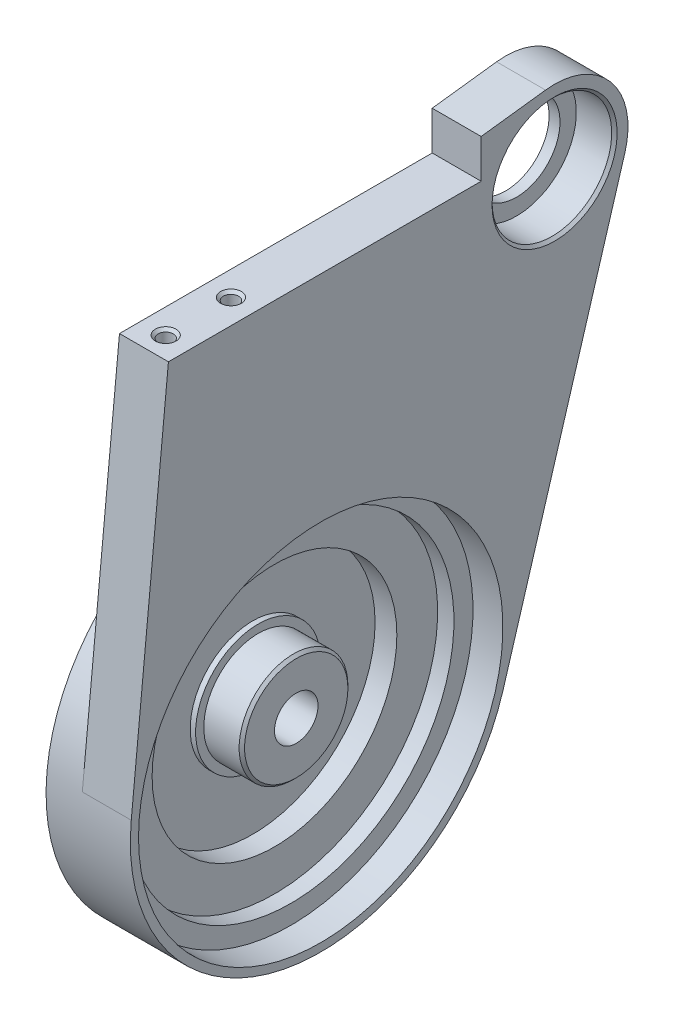
ISO-10303-21;
HEADER;
FILE_DESCRIPTION(('STEP AP214'),'2;1');
FILE_NAME('part.step','',(''),(''),'','','');
FILE_SCHEMA(('AUTOMOTIVE_DESIGN { 1 0 10303 214 1 1 1 1 }'));
ENDSEC;
DATA;
#1=APPLICATION_CONTEXT('core data for automotive mechanical design processes');
#2=APPLICATION_PROTOCOL_DEFINITION('international standard','automotive_design',2000,#1);
#3=PRODUCT_CONTEXT('',#1,'mechanical');
#4=PRODUCT('Part','Part','',(#3));
#5=PRODUCT_RELATED_PRODUCT_CATEGORY('part','',(#4));
#6=PRODUCT_DEFINITION_FORMATION('','',#4);
#7=PRODUCT_DEFINITION_CONTEXT('part definition',#1,'design');
#8=PRODUCT_DEFINITION('design','',#6,#7);
#9=PRODUCT_DEFINITION_SHAPE('','',#8);
#10=(LENGTH_UNIT() NAMED_UNIT(*) SI_UNIT(.MILLI.,.METRE.));
#11=(NAMED_UNIT(*) PLANE_ANGLE_UNIT() SI_UNIT($,.RADIAN.));
#12=(NAMED_UNIT(*) SI_UNIT($,.STERADIAN.) SOLID_ANGLE_UNIT());
#13=UNCERTAINTY_MEASURE_WITH_UNIT(LENGTH_MEASURE(1.E-05),#10,'distance_accuracy_value','');
#14=(GEOMETRIC_REPRESENTATION_CONTEXT(3) GLOBAL_UNCERTAINTY_ASSIGNED_CONTEXT((#13)) GLOBAL_UNIT_ASSIGNED_CONTEXT((#10,
#11,#12)) REPRESENTATION_CONTEXT('',''));
#15=CARTESIAN_POINT('',(0.,0.,0.));
#16=DIRECTION('',(0.,0.,1.));
#17=DIRECTION('',(1.,0.,0.));
#18=AXIS2_PLACEMENT_3D('',#15,#16,#17);
#19=CARTESIAN_POINT('',(-39.,0.,0.));
#20=DIRECTION('',(-1.,0.,0.));
#21=DIRECTION('',(0.,0.,-1.));
#22=AXIS2_PLACEMENT_3D('',#19,#20,#21);
#23=CYLINDRICAL_SURFACE('',#22,35.);
#24=DIRECTION('',(-1.,0.,0.));
#25=VECTOR('',#24,1.);
#26=CARTESIAN_POINT('',(-49.5,34.8134096858353,-3.60922513099308));
#27=LINE('',#26,#25);
#28=CARTESIAN_POINT('',(-49.,34.8134096858353,-3.60922513099308));
#29=VERTEX_POINT('',#28);
#30=CARTESIAN_POINT('',(-51.,34.8134096858353,-3.60922513099308));
#31=VERTEX_POINT('',#30);
#32=EDGE_CURVE('E192',#29,#31,#27,.T.);
#33=ORIENTED_EDGE('',*,*,#32,.T.);
#34=CARTESIAN_POINT('',(-51.,0.,0.));
#35=DIRECTION('',(-1.,0.,0.));
#36=DIRECTION('',(0.,0.,1.));
#37=AXIS2_PLACEMENT_3D('',#34,#35,#36);
#38=CIRCLE('',#37,35.);
#39=CARTESIAN_POINT('',(-51.,31.687306646543,-14.8631960724453));
#40=VERTEX_POINT('',#39);
#41=EDGE_CURVE('E307',#31,#40,#38,.T.);
#42=ORIENTED_EDGE('',*,*,#41,.T.);
#43=DIRECTION('',(-1.,0.,0.));
#44=VECTOR('',#43,1.);
#45=CARTESIAN_POINT('',(-49.5,31.687306646543,-14.8631960724453));
#46=LINE('',#45,#44);
#47=CARTESIAN_POINT('',(-49.,31.687306646543,-14.8631960724453));
#48=VERTEX_POINT('',#47);
#49=EDGE_CURVE('E189',#40,#48,#46,.F.);
#50=ORIENTED_EDGE('',*,*,#49,.T.);
#51=CARTESIAN_POINT('',(-48.,31.2349355305614,-15.7917320899791));
#52=CARTESIAN_POINT('',(-47.9999592632382,31.2616744252843,-15.7388572138157));
#53=CARTESIAN_POINT('',(-48.0050121835829,31.2882606540519,-15.6859256306739));
#54=CARTESIAN_POINT('',(-48.0249308728801,31.3404177754603,-15.581447752128));
#55=CARTESIAN_POINT('',(-48.0397931056785,31.3659890304682,-15.5299009644858));
#56=CARTESIAN_POINT('',(-48.0789645408244,31.4154366771404,-15.4296304619864));
#57=CARTESIAN_POINT('',(-48.1032776388826,31.4393123650744,-15.3809079208321));
#58=CARTESIAN_POINT('',(-48.1607006999334,31.4847165854457,-15.287750032336));
#59=CARTESIAN_POINT('',(-48.1938088531873,31.506245599469,-15.2433138055702));
#60=CARTESIAN_POINT('',(-48.2677831373511,31.5462657534545,-15.1603177552285));
#61=CARTESIAN_POINT('',(-48.3086081974847,31.5647720505674,-15.121728686835));
#62=CARTESIAN_POINT('',(-48.3970623415213,31.5983506779795,-15.051436993619));
#63=CARTESIAN_POINT('',(-48.4446919969584,31.6134227195511,-15.0197349478182));
#64=CARTESIAN_POINT('',(-48.543968699383,31.6392859195574,-14.9651754297504));
#65=CARTESIAN_POINT('',(-48.5954635886536,31.6501863189463,-14.9420927106323));
#66=CARTESIAN_POINT('',(-48.7021019951056,31.6679397000589,-14.9044299933955));
#67=CARTESIAN_POINT('',(-48.7572411412375,31.6747974361222,-14.8898400077256));
#68=CARTESIAN_POINT('',(-48.8440658989104,31.6821099223784,-14.8742712566105));
#69=CARTESIAN_POINT('',(-48.87509537446,31.6840576967791,-14.870121141594));
#70=CARTESIAN_POINT('',(-48.9374111252453,31.6866554928566,-14.8645843372343));
#71=CARTESIAN_POINT('',(-48.968696995447,31.6873072697895,-14.8631939102659));
#72=CARTESIAN_POINT('',(-49.,31.687306646543,-14.8631960724453));
#73=B_SPLINE_CURVE_WITH_KNOTS('',3,(#51,#52,#53,#54,#55,#56,#57,#58,#59,#60,#61,#62,#63,#64,#65,
#66,#67,#68,#69,#70,#71,#72),.UNSPECIFIED.,.F.,.F.,(4,2,2,2,2,2,2,2,2,2,4),(0.,
0.177513985198611,0.3549640133935,0.532487265389794,0.709974017083849,0.886541473270198,
1.0631237685023,1.23470038567406,1.40607481699872,1.50004007936717,1.59387799137899),.UNSPECIFIED.);
#74=CARTESIAN_POINT('',(-48.,31.2349355305614,-15.7917320899791));
#75=VERTEX_POINT('',#74);
#76=EDGE_CURVE('E312',#75,#48,#73,.T.);
#77=ORIENTED_EDGE('',*,*,#76,.F.);
#78=CARTESIAN_POINT('',(-48.,0.,0.));
#79=DIRECTION('',(-1.,0.,0.));
#80=DIRECTION('',(0.,0.,1.));
#81=AXIS2_PLACEMENT_3D('',#78,#79,#80);
#82=CIRCLE('',#81,35.);
#83=CARTESIAN_POINT('',(-48.,-10.0957470928432,-33.5123244588815));
#84=VERTEX_POINT('',#83);
#85=EDGE_CURVE('E231',#84,#75,#82,.F.);
#86=ORIENTED_EDGE('',*,*,#85,.F.);
#87=DIRECTION('',(-1.,0.,0.));
#88=VECTOR('',#87,1.);
#89=CARTESIAN_POINT('',(-39.,-10.0957470928432,-33.5123244588815));
#90=LINE('',#89,#88);
#91=CARTESIAN_POINT('',(-39.,-10.0957470928432,-33.5123244588815));
#92=VERTEX_POINT('',#91);
#93=EDGE_CURVE('E268',#92,#84,#90,.T.);
#94=ORIENTED_EDGE('',*,*,#93,.F.);
#95=CARTESIAN_POINT('',(-39.,0.,0.));
#96=DIRECTION('',(-1.,0.,0.));
#97=DIRECTION('',(0.,0.,1.));
#98=AXIS2_PLACEMENT_3D('',#95,#96,#97);
#99=CIRCLE('',#98,35.);
#100=CARTESIAN_POINT('',(-39.,3.42042393123537,34.8324661792793));
#101=VERTEX_POINT('',#100);
#102=EDGE_CURVE('E253',#92,#101,#99,.T.);
#103=ORIENTED_EDGE('',*,*,#102,.T.);
#104=DIRECTION('',(-1.,0.,0.));
#105=VECTOR('',#104,1.);
#106=CARTESIAN_POINT('',(-39.,3.42042393123537,34.8324661792793));
#107=LINE('',#106,#105);
#108=CARTESIAN_POINT('',(-48.,3.42042393123537,34.8324661792793));
#109=VERTEX_POINT('',#108);
#110=EDGE_CURVE('E286',#101,#109,#107,.T.);
#111=ORIENTED_EDGE('',*,*,#110,.T.);
#112=CARTESIAN_POINT('',(-48.,34.9047492831922,-2.58040258050802));
#113=VERTEX_POINT('',#112);
#114=EDGE_CURVE('E230',#113,#109,#82,.F.);
#115=ORIENTED_EDGE('',*,*,#114,.F.);
#116=CARTESIAN_POINT('',(-49.,34.8134096858353,-3.60922513099308));
#117=CARTESIAN_POINT('',(-48.9726356121736,34.8134094352451,-3.60922569305726));
#118=CARTESIAN_POINT('',(-48.9452847121818,34.8135305500028,-3.60805951301618));
#119=CARTESIAN_POINT('',(-48.8907864964406,34.8140119646794,-3.60341213762526));
#120=CARTESIAN_POINT('',(-48.8636391508467,34.8143722288132,-3.5999312886317));
#121=CARTESIAN_POINT('',(-48.7829121911346,34.8158036957728,-3.58607090046661));
#122=CARTESIAN_POINT('',(-48.7298860989902,34.817225616827,-3.5722732710529));
#123=CARTESIAN_POINT('',(-48.626937297955,34.8209224871209,-3.53605484832459));
#124=CARTESIAN_POINT('',(-48.5770145523576,34.8231974262688,-3.51363415702679));
#125=CARTESIAN_POINT('',(-48.4815436387015,34.8284754079396,-3.46092471558382));
#126=CARTESIAN_POINT('',(-48.435996411843,34.831478606628,-3.43063427777692));
#127=CARTESIAN_POINT('',(-48.3495567492925,34.8381269942425,-3.36245454411341));
#128=CARTESIAN_POINT('',(-48.3087759469558,34.8417838473524,-3.32442507321176));
#129=CARTESIAN_POINT('',(-48.2339186226643,34.8495232044921,-3.2422880624267));
#130=CARTESIAN_POINT('',(-48.1998440093348,34.853605829195,-3.19817879825023));
#131=CARTESIAN_POINT('',(-48.1380694553502,34.8621769230677,-3.10337957879432));
#132=CARTESIAN_POINT('',(-48.110651710087,34.8666748156835,-3.05250664127353));
#133=CARTESIAN_POINT('',(-48.0645569313515,34.8757542131405,-2.94695943233439));
#134=CARTESIAN_POINT('',(-48.0458773749463,34.8803356934504,-2.89228626338044));
#135=CARTESIAN_POINT('',(-48.0212581493575,34.8882752153471,-2.79463994487654));
#136=CARTESIAN_POINT('',(-48.0132995419636,34.8916523206117,-2.75216550508537));
#137=CARTESIAN_POINT('',(-48.002669499544,34.8982964731773,-2.66660255618611));
#138=CARTESIAN_POINT('',(-47.9999919401606,34.901563643639,-2.62351481681534));
#139=CARTESIAN_POINT('',(-48.,34.9047492831922,-2.58040258050802));
#140=B_SPLINE_CURVE_WITH_KNOTS('',3,(#116,#117,#118,#119,#120,#121,#122,#123,#124,#125,#126,
#127,#128,#129,#130,#131,#132,#133,#134,#135,#136,#137,#138,#139),.UNSPECIFIED.,.F.,.F.,(4,2,2,
2,2,2,2,2,2,2,2,4),(0.,0.0820414744675156,0.164070675392366,0.32765072824154,0.49122884588489,
0.654842071739815,0.821735608814192,0.988676576411267,1.16178843583303,1.33485028264958,
1.46457326948109,1.59414572971458),.UNSPECIFIED.);
#141=EDGE_CURVE('E320',#29,#113,#140,.T.);
#142=ORIENTED_EDGE('',*,*,#141,.F.);
#143=EDGE_LOOP('',(#33,#42,#50,#77,#86,#94,#103,#111,#115,#142));
#144=FACE_BOUND('',#143,.T.);
#145=DIRECTION('',(-1.,0.,0.));
#146=VECTOR('',#145,1.);
#147=CARTESIAN_POINT('',(-39.,29.7,-18.5178292464317));
#148=LINE('',#147,#146);
#149=CARTESIAN_POINT('',(-54.5,29.7,-18.5178292464317));
#150=VERTEX_POINT('',#149);
#151=CARTESIAN_POINT('',(-51.5,29.7,-18.5178292464317));
#152=VERTEX_POINT('',#151);
#153=EDGE_CURVE('E151',#150,#152,#148,.F.);
#154=ORIENTED_EDGE('',*,*,#153,.T.);
#155=CARTESIAN_POINT('',(-51.5,0.,0.));
#156=DIRECTION('',(-1.,0.,0.));
#157=DIRECTION('',(0.,0.,1.));
#158=AXIS2_PLACEMENT_3D('',#155,#156,#157);
#159=CIRCLE('',#158,35.);
#160=CARTESIAN_POINT('',(-51.5,34.5246608769893,-5.74872084283873));
#161=VERTEX_POINT('',#160);
#162=EDGE_CURVE('E160',#161,#152,#159,.T.);
#163=ORIENTED_EDGE('',*,*,#162,.F.);
#164=DIRECTION('',(-1.,0.,0.));
#165=VECTOR('',#164,1.);
#166=CARTESIAN_POINT('',(-53.,34.5246608769893,-5.74872084283872));
#167=LINE('',#166,#165);
#168=CARTESIAN_POINT('',(-54.5,34.5246608769892,-5.74872084283876));
#169=VERTEX_POINT('',#168);
#170=EDGE_CURVE('E205',#161,#169,#167,.T.);
#171=ORIENTED_EDGE('',*,*,#170,.T.);
#172=CARTESIAN_POINT('',(-54.5,0.,0.));
#173=DIRECTION('',(1.,0.,0.));
#174=DIRECTION('',(0.,0.,-1.));
#175=AXIS2_PLACEMENT_3D('',#172,#173,#174);
#176=CIRCLE('',#175,35.);
#177=EDGE_CURVE('E224',#169,#150,#176,.T.);
#178=ORIENTED_EDGE('',*,*,#177,.T.);
#179=EDGE_LOOP('',(#154,#163,#171,#178));
#180=FACE_BOUND('',#179,.T.);
#181=ADVANCED_FACE('F41',(#144,#180),#23,.T.);
#182=CARTESIAN_POINT('',(-54.5,4.,0.));
#183=DIRECTION('',(1.,0.,0.));
#184=DIRECTION('',(0.,0.,1.));
#185=AXIS2_PLACEMENT_3D('',#182,#183,#184);
#186=PLANE('',#185);
#187=CARTESIAN_POINT('',(-54.5,0.,0.));
#188=DIRECTION('',(1.,0.,0.));
#189=DIRECTION('',(0.,0.,-1.));
#190=AXIS2_PLACEMENT_3D('',#187,#188,#189);
#191=CIRCLE('',#190,4.);
#192=CARTESIAN_POINT('',(-54.5,0.,-4.));
#193=VERTEX_POINT('',#192);
#194=EDGE_CURVE('E227',#193,#193,#191,.T.);
#195=ORIENTED_EDGE('',*,*,#194,.T.);
#196=EDGE_LOOP('',(#195));
#197=FACE_BOUND('',#196,.T.);
#198=DIRECTION('',(0.,1.,0.));
#199=VECTOR('',#198,1.);
#200=CARTESIAN_POINT('',(-54.5,42.3,-10.));
#201=LINE('',#200,#199);
#202=CARTESIAN_POINT('',(-54.5,29.7,-10.));
#203=VERTEX_POINT('',#202);
#204=CARTESIAN_POINT('',(-54.5,31.5,-10.));
#205=VERTEX_POINT('',#204);
#206=EDGE_CURVE('E164',#203,#205,#201,.T.);
#207=ORIENTED_EDGE('',*,*,#206,.F.);
#208=DIRECTION('',(0.,0.,1.));
#209=VECTOR('',#208,1.);
#210=CARTESIAN_POINT('',(-54.5,29.7,-10.));
#211=LINE('',#210,#209);
#212=EDGE_CURVE('E147',#150,#203,#211,.T.);
#213=ORIENTED_EDGE('',*,*,#212,.F.);
#214=ORIENTED_EDGE('',*,*,#177,.F.);
#215=CARTESIAN_POINT('',(-54.5,36.,-10.));
#216=DIRECTION('',(-1.,0.,0.));
#217=DIRECTION('',(0.,0.,1.));
#218=AXIS2_PLACEMENT_3D('',#215,#216,#217);
#219=CIRCLE('',#218,4.5);
#220=EDGE_CURVE('E202',#205,#169,#219,.T.);
#221=ORIENTED_EDGE('',*,*,#220,.F.);
#222=EDGE_LOOP('',(#207,#213,#214,#221));
#223=FACE_BOUND('',#222,.T.);
#224=ADVANCED_FACE('F353',(#197,#223),#186,.F.);
#225=CARTESIAN_POINT('',(-51.5,36.,-10.));
#226=DIRECTION('',(-1.,0.,0.));
#227=DIRECTION('',(0.,0.,-1.));
#228=AXIS2_PLACEMENT_3D('',#225,#226,#227);
#229=CYLINDRICAL_SURFACE('',#228,4.5);
#230=ORIENTED_EDGE('',*,*,#220,.T.);
#231=ORIENTED_EDGE('',*,*,#170,.F.);
#232=CARTESIAN_POINT('',(-51.5,36.,-10.));
#233=DIRECTION('',(-1.,0.,0.));
#234=DIRECTION('',(0.,0.,1.));
#235=AXIS2_PLACEMENT_3D('',#232,#233,#234);
#236=CIRCLE('',#235,4.5);
#237=CARTESIAN_POINT('',(-51.5,31.5,-10.));
#238=VERTEX_POINT('',#237);
#239=EDGE_CURVE('E203',#238,#161,#236,.T.);
#240=ORIENTED_EDGE('',*,*,#239,.F.);
#241=DIRECTION('',(-1.,0.,0.));
#242=VECTOR('',#241,1.);
#243=CARTESIAN_POINT('',(-51.5,31.5,-10.));
#244=LINE('',#243,#242);
#245=EDGE_CURVE('E11',#205,#238,#244,.F.);
#246=ORIENTED_EDGE('',*,*,#245,.F.);
#247=EDGE_LOOP('',(#230,#231,#240,#246));
#248=FACE_BOUND('',#247,.T.);
#249=ADVANCED_FACE('F358',(#248),#229,.F.);
#250=CARTESIAN_POINT('',(-51.5,0.,0.));
#251=DIRECTION('',(1.,0.,0.));
#252=DIRECTION('',(0.,0.,1.));
#253=AXIS2_PLACEMENT_3D('',#250,#251,#252);
#254=CYLINDRICAL_SURFACE('',#253,22.5);
#255=CARTESIAN_POINT('',(-51.5,0.,0.));
#256=DIRECTION('',(1.,0.,0.));
#257=DIRECTION('',(0.,0.,-1.));
#258=AXIS2_PLACEMENT_3D('',#255,#256,#257);
#259=CIRCLE('',#258,22.5);
#260=CARTESIAN_POINT('',(-51.5,0.,-22.5));
#261=VERTEX_POINT('',#260);
#262=EDGE_CURVE('E221',#261,#261,#259,.T.);
#263=ORIENTED_EDGE('',*,*,#262,.F.);
#264=EDGE_LOOP('',(#263));
#265=FACE_BOUND('',#264,.T.);
#266=CARTESIAN_POINT('',(-47.5,0.,0.));
#267=DIRECTION('',(-1.,0.,0.));
#268=DIRECTION('',(0.,0.,1.));
#269=AXIS2_PLACEMENT_3D('',#266,#267,#268);
#270=CIRCLE('',#269,22.5);
#271=CARTESIAN_POINT('',(-47.5,0.,22.5));
#272=VERTEX_POINT('',#271);
#273=EDGE_CURVE('E172',#272,#272,#270,.F.);
#274=ORIENTED_EDGE('',*,*,#273,.T.);
#275=EDGE_LOOP('',(#274));
#276=FACE_BOUND('',#275,.T.);
#277=ADVANCED_FACE('F370',(#265,#276),#254,.F.);
#278=CARTESIAN_POINT('',(-39.,68.2,-43.));
#279=DIRECTION('',(-1.,0.,0.));
#280=DIRECTION('',(0.,0.,-1.));
#281=AXIS2_PLACEMENT_3D('',#278,#279,#280);
#282=CYLINDRICAL_SURFACE('',#281,8.);
#283=CARTESIAN_POINT('',(-48.,68.2,-43.));
#284=DIRECTION('',(-1.,0.,0.));
#285=DIRECTION('',(0.,0.,1.));
#286=AXIS2_PLACEMENT_3D('',#283,#284,#285);
#287=CIRCLE('',#286,8.);
#288=CARTESIAN_POINT('',(-48.,68.2,-35.));
#289=VERTEX_POINT('',#288);
#290=EDGE_CURVE('E199',#289,#289,#287,.T.);
#291=ORIENTED_EDGE('',*,*,#290,.T.);
#292=EDGE_LOOP('',(#291));
#293=FACE_BOUND('',#292,.T.);
#294=CARTESIAN_POINT('',(-46.,68.2,-43.));
#295=DIRECTION('',(-1.,0.,0.));
#296=DIRECTION('',(0.,0.,1.));
#297=AXIS2_PLACEMENT_3D('',#294,#295,#296);
#298=CIRCLE('',#297,8.);
#299=CARTESIAN_POINT('',(-46.,68.2,-35.));
#300=VERTEX_POINT('',#299);
#301=EDGE_CURVE('E198',#300,#300,#298,.T.);
#302=ORIENTED_EDGE('',*,*,#301,.F.);
#303=EDGE_LOOP('',(#302));
#304=FACE_BOUND('',#303,.T.);
#305=ADVANCED_FACE('F375',(#293,#304),#282,.F.);
#306=CARTESIAN_POINT('',(-48.,0.,0.));
#307=DIRECTION('',(1.,0.,0.));
#308=DIRECTION('',(0.,0.,1.));
#309=AXIS2_PLACEMENT_3D('',#306,#307,#308);
#310=PLANE('',#309);
#311=ORIENTED_EDGE('',*,*,#114,.T.);
#312=DIRECTION('',(0.,0.995213319407978,-0.0977263980352962));
#313=VECTOR('',#312,1.);
#314=CARTESIAN_POINT('',(-48.,3.42042393123537,34.8324661792793));
#315=LINE('',#314,#313);
#316=CARTESIAN_POINT('',(-48.,73.,28.));
#317=VERTEX_POINT('',#316);
#318=EDGE_CURVE('E252',#109,#317,#315,.T.);
#319=ORIENTED_EDGE('',*,*,#318,.T.);
#320=DIRECTION('',(0.,0.,1.));
#321=VECTOR('',#320,1.);
#322=CARTESIAN_POINT('',(-48.,73.,-29.5));
#323=LINE('',#322,#321);
#324=CARTESIAN_POINT('',(-48.,73.,-29.5));
#325=VERTEX_POINT('',#324);
#326=EDGE_CURVE('E237',#325,#317,#323,.T.);
#327=ORIENTED_EDGE('',*,*,#326,.F.);
#328=DIRECTION('',(0.,1.,0.));
#329=VECTOR('',#328,1.);
#330=CARTESIAN_POINT('',(-48.,0.,-29.5));
#331=LINE('',#330,#329);
#332=CARTESIAN_POINT('',(-48.,80.1294958726815,-29.5));
#333=VERTEX_POINT('',#332);
#334=EDGE_CURVE('E289',#325,#333,#331,.T.);
#335=ORIENTED_EDGE('',*,*,#334,.T.);
#336=DIRECTION('',(0.,0.123048973547403,-0.992400599611332));
#337=VECTOR('',#336,1.);
#338=CARTESIAN_POINT('',(-48.,73.,28.));
#339=LINE('',#338,#337);
#340=CARTESIAN_POINT('',(-48.,81.5974080947529,-41.3388388571093));
#341=VERTEX_POINT('',#340);
#342=EDGE_CURVE('E271',#333,#341,#339,.T.);
#343=ORIENTED_EDGE('',*,*,#342,.T.);
#344=CARTESIAN_POINT('',(-48.,68.2,-43.));
#345=DIRECTION('',(-1.,0.,0.));
#346=DIRECTION('',(0.,0.,1.));
#347=AXIS2_PLACEMENT_3D('',#344,#345,#346);
#348=CIRCLE('',#347,13.5);
#349=CARTESIAN_POINT('',(-48.,64.3059261213319,-55.9261822912829));
#350=VERTEX_POINT('',#349);
#351=EDGE_CURVE('E274',#341,#350,#348,.T.);
#352=ORIENTED_EDGE('',*,*,#351,.T.);
#353=DIRECTION('',(0.,-0.957494984539472,0.288449916938376));
#354=VECTOR('',#353,1.);
#355=CARTESIAN_POINT('',(-48.,64.3059261213319,-55.9261822912829));
#356=LINE('',#355,#354);
#357=EDGE_CURVE('E257',#350,#84,#356,.T.);
#358=ORIENTED_EDGE('',*,*,#357,.T.);
#359=ORIENTED_EDGE('',*,*,#85,.T.);
#360=CARTESIAN_POINT('',(-48.,36.,-10.));
#361=DIRECTION('',(-1.,0.,0.));
#362=DIRECTION('',(0.,0.,1.));
#363=AXIS2_PLACEMENT_3D('',#360,#361,#362);
#364=CIRCLE('',#363,7.5);
#365=EDGE_CURVE('E56',#113,#75,#364,.T.);
#366=ORIENTED_EDGE('',*,*,#365,.F.);
#367=EDGE_LOOP('',(#311,#319,#327,#335,#343,#352,#358,#359,#366));
#368=FACE_BOUND('',#367,.T.);
#369=ORIENTED_EDGE('',*,*,#290,.F.);
#370=EDGE_LOOP('',(#369));
#371=FACE_BOUND('',#370,.T.);
#372=ADVANCED_FACE('F428',(#368,#371),#310,.F.);
#373=CARTESIAN_POINT('',(-39.,73.,28.));
#374=DIRECTION('',(0.,-0.992400599611332,-0.123048973547403));
#375=DIRECTION('',(0.,-0.123048973547403,0.992400599611332));
#376=AXIS2_PLACEMENT_3D('',#373,#374,#375);
#377=PLANE('',#376);
#378=DIRECTION('',(1.,0.,0.));
#379=VECTOR('',#378,1.);
#380=CARTESIAN_POINT('',(-39.,80.1294958726815,-29.5));
#381=LINE('',#380,#379);
#382=CARTESIAN_POINT('',(-39.,80.1294958726815,-29.5));
#383=VERTEX_POINT('',#382);
#384=EDGE_CURVE('E249',#333,#383,#381,.T.);
#385=ORIENTED_EDGE('',*,*,#384,.T.);
#386=DIRECTION('',(0.,0.123048973547403,-0.992400599611332));
#387=VECTOR('',#386,1.);
#388=CARTESIAN_POINT('',(-39.,73.,28.));
#389=LINE('',#388,#387);
#390=CARTESIAN_POINT('',(-39.,81.5974080947529,-41.3388388571093));
#391=VERTEX_POINT('',#390);
#392=EDGE_CURVE('E260',#383,#391,#389,.T.);
#393=ORIENTED_EDGE('',*,*,#392,.T.);
#394=DIRECTION('',(-1.,0.,0.));
#395=VECTOR('',#394,1.);
#396=CARTESIAN_POINT('',(-39.,81.5974080947529,-41.3388388571093));
#397=LINE('',#396,#395);
#398=EDGE_CURVE('E282',#391,#341,#397,.T.);
#399=ORIENTED_EDGE('',*,*,#398,.T.);
#400=ORIENTED_EDGE('',*,*,#342,.F.);
#401=EDGE_LOOP('',(#385,#393,#399,#400));
#402=FACE_BOUND('',#401,.T.);
#403=ADVANCED_FACE('F426',(#402),#377,.F.);
#404=CARTESIAN_POINT('',(-39.,0.,0.));
#405=DIRECTION('',(1.,0.,0.));
#406=DIRECTION('',(0.,0.,1.));
#407=AXIS2_PLACEMENT_3D('',#404,#405,#406);
#408=PLANE('',#407);
#409=CARTESIAN_POINT('',(-39.,68.2,-43.));
#410=DIRECTION('',(-1.,0.,0.));
#411=DIRECTION('',(0.,0.,1.));
#412=AXIS2_PLACEMENT_3D('',#409,#410,#411);
#413=CIRCLE('',#412,11.5);
#414=CARTESIAN_POINT('',(-39.,68.2,-31.5));
#415=VERTEX_POINT('',#414);
#416=EDGE_CURVE('E304',#415,#415,#413,.F.);
#417=ORIENTED_EDGE('',*,*,#416,.F.);
#418=EDGE_LOOP('',(#417));
#419=FACE_BOUND('',#418,.T.);
#420=CARTESIAN_POINT('',(-39.,0.,0.));
#421=DIRECTION('',(-1.,0.,0.));
#422=DIRECTION('',(0.,0.,1.));
#423=AXIS2_PLACEMENT_3D('',#420,#421,#422);
#424=CIRCLE('',#423,33.5);
#425=CARTESIAN_POINT('',(-39.,0.,33.5));
#426=VERTEX_POINT('',#425);
#427=EDGE_CURVE('E233',#426,#426,#424,.T.);
#428=ORIENTED_EDGE('',*,*,#427,.T.);
#429=EDGE_LOOP('',(#428));
#430=FACE_BOUND('',#429,.T.);
#431=CARTESIAN_POINT('',(-39.,68.2,-43.));
#432=DIRECTION('',(-1.,0.,0.));
#433=DIRECTION('',(0.,0.,1.));
#434=AXIS2_PLACEMENT_3D('',#431,#432,#433);
#435=CIRCLE('',#434,13.5);
#436=CARTESIAN_POINT('',(-39.,64.3059261213319,-55.9261822912829));
#437=VERTEX_POINT('',#436);
#438=EDGE_CURVE('E263',#391,#437,#435,.T.);
#439=ORIENTED_EDGE('',*,*,#438,.F.);
#440=ORIENTED_EDGE('',*,*,#392,.F.);
#441=DIRECTION('',(0.,1.,0.));
#442=VECTOR('',#441,1.);
#443=CARTESIAN_POINT('',(-39.,0.,-29.5));
#444=LINE('',#443,#442);
#445=CARTESIAN_POINT('',(-39.,73.,-29.5));
#446=VERTEX_POINT('',#445);
#447=EDGE_CURVE('E247',#446,#383,#444,.T.);
#448=ORIENTED_EDGE('',*,*,#447,.F.);
#449=DIRECTION('',(0.,0.,-1.));
#450=VECTOR('',#449,1.);
#451=CARTESIAN_POINT('',(-39.,73.,0.));
#452=LINE('',#451,#450);
#453=CARTESIAN_POINT('',(-39.,73.,28.));
#454=VERTEX_POINT('',#453);
#455=EDGE_CURVE('E244',#454,#446,#452,.T.);
#456=ORIENTED_EDGE('',*,*,#455,.F.);
#457=DIRECTION('',(0.,0.995213319407978,-0.0977263980352962));
#458=VECTOR('',#457,1.);
#459=CARTESIAN_POINT('',(-39.,3.42042393123537,34.8324661792793));
#460=LINE('',#459,#458);
#461=EDGE_CURVE('E256',#101,#454,#460,.T.);
#462=ORIENTED_EDGE('',*,*,#461,.F.);
#463=ORIENTED_EDGE('',*,*,#102,.F.);
#464=DIRECTION('',(0.,-0.957494984539472,0.288449916938376));
#465=VECTOR('',#464,1.);
#466=CARTESIAN_POINT('',(-39.,64.3059261213319,-55.9261822912829));
#467=LINE('',#466,#465);
#468=EDGE_CURVE('E266',#437,#92,#467,.T.);
#469=ORIENTED_EDGE('',*,*,#468,.F.);
#470=EDGE_LOOP('',(#439,#440,#448,#456,#462,#463,#469));
#471=FACE_BOUND('',#470,.T.);
#472=ADVANCED_FACE('F422',(#419,#430,#471),#408,.T.);
#473=CARTESIAN_POINT('',(-39.,3.42042393123537,34.8324661792793));
#474=DIRECTION('',(0.,-0.0977263980352962,-0.995213319407978));
#475=DIRECTION('',(0.,-0.995213319407978,0.0977263980352962));
#476=AXIS2_PLACEMENT_3D('',#473,#474,#475);
#477=PLANE('',#476);
#478=ORIENTED_EDGE('',*,*,#318,.F.);
#479=ORIENTED_EDGE('',*,*,#110,.F.);
#480=ORIENTED_EDGE('',*,*,#461,.T.);
#481=DIRECTION('',(-1.,0.,0.));
#482=VECTOR('',#481,1.);
#483=CARTESIAN_POINT('',(-39.,73.,28.));
#484=LINE('',#483,#482);
#485=EDGE_CURVE('E284',#454,#317,#484,.T.);
#486=ORIENTED_EDGE('',*,*,#485,.T.);
#487=EDGE_LOOP('',(#478,#479,#480,#486));
#488=FACE_BOUND('',#487,.T.);
#489=ADVANCED_FACE('F425',(#488),#477,.F.);
#490=CARTESIAN_POINT('',(-39.,68.2,-43.));
#491=DIRECTION('',(-1.,0.,0.));
#492=DIRECTION('',(0.,0.,-1.));
#493=AXIS2_PLACEMENT_3D('',#490,#491,#492);
#494=CYLINDRICAL_SURFACE('',#493,13.5);
#495=ORIENTED_EDGE('',*,*,#351,.F.);
#496=ORIENTED_EDGE('',*,*,#398,.F.);
#497=ORIENTED_EDGE('',*,*,#438,.T.);
#498=DIRECTION('',(-1.,0.,0.));
#499=VECTOR('',#498,1.);
#500=CARTESIAN_POINT('',(-39.,64.3059261213319,-55.9261822912829));
#501=LINE('',#500,#499);
#502=EDGE_CURVE('E280',#437,#350,#501,.T.);
#503=ORIENTED_EDGE('',*,*,#502,.T.);
#504=EDGE_LOOP('',(#495,#496,#497,#503));
#505=FACE_BOUND('',#504,.T.);
#506=ADVANCED_FACE('F433',(#505),#494,.T.);
#507=CARTESIAN_POINT('',(-39.,64.3059261213319,-55.9261822912829));
#508=DIRECTION('',(0.,0.288449916938376,0.957494984539472));
#509=DIRECTION('',(0.,0.957494984539472,-0.288449916938377));
#510=AXIS2_PLACEMENT_3D('',#507,#508,#509);
#511=PLANE('',#510);
#512=ORIENTED_EDGE('',*,*,#357,.F.);
#513=ORIENTED_EDGE('',*,*,#502,.F.);
#514=ORIENTED_EDGE('',*,*,#468,.T.);
#515=ORIENTED_EDGE('',*,*,#93,.T.);
#516=EDGE_LOOP('',(#512,#513,#514,#515));
#517=FACE_BOUND('',#516,.T.);
#518=ADVANCED_FACE('F420',(#517),#511,.F.);
#519=CARTESIAN_POINT('',(-8.,150.,-29.5));
#520=DIRECTION('',(0.,0.,1.));
#521=DIRECTION('',(-1.,0.,0.));
#522=AXIS2_PLACEMENT_3D('',#519,#520,#521);
#523=PLANE('',#522);
#524=ORIENTED_EDGE('',*,*,#384,.F.);
#525=ORIENTED_EDGE('',*,*,#334,.F.);
#526=DIRECTION('',(-1.,0.,0.));
#527=VECTOR('',#526,1.);
#528=CARTESIAN_POINT('',(-8.,73.,-29.5));
#529=LINE('',#528,#527);
#530=EDGE_CURVE('E242',#446,#325,#529,.T.);
#531=ORIENTED_EDGE('',*,*,#530,.F.);
#532=ORIENTED_EDGE('',*,*,#447,.T.);
#533=EDGE_LOOP('',(#524,#525,#531,#532));
#534=FACE_BOUND('',#533,.T.);
#535=ADVANCED_FACE('F416',(#534),#523,.T.);
#536=CARTESIAN_POINT('',(-8.,73.,-29.5));
#537=DIRECTION('',(0.,1.,0.));
#538=DIRECTION('',(0.,0.,-1.));
#539=AXIS2_PLACEMENT_3D('',#536,#537,#538);
#540=PLANE('',#539);
#541=CARTESIAN_POINT('',(-43.5,73.,24.));
#542=DIRECTION('',(0.,-1.,0.));
#543=DIRECTION('',(0.,0.,-1.));
#544=AXIS2_PLACEMENT_3D('',#541,#542,#543);
#545=CIRCLE('',#544,1.89999999999999);
#546=CARTESIAN_POINT('',(-43.5,73.,22.1));
#547=VERTEX_POINT('',#546);
#548=EDGE_CURVE('E869',#547,#547,#545,.F.);
#549=ORIENTED_EDGE('',*,*,#548,.F.);
#550=EDGE_LOOP('',(#549));
#551=FACE_BOUND('',#550,.T.);
#552=CARTESIAN_POINT('',(-43.5,73.,12.));
#553=DIRECTION('',(0.,-1.,0.));
#554=DIRECTION('',(0.,0.,-1.));
#555=AXIS2_PLACEMENT_3D('',#552,#553,#554);
#556=CIRCLE('',#555,1.90000000000003);
#557=CARTESIAN_POINT('',(-43.5,73.,10.1));
#558=VERTEX_POINT('',#557);
#559=EDGE_CURVE('E871',#558,#558,#556,.F.);
#560=ORIENTED_EDGE('',*,*,#559,.F.);
#561=EDGE_LOOP('',(#560));
#562=FACE_BOUND('',#561,.T.);
#563=ORIENTED_EDGE('',*,*,#485,.F.);
#564=ORIENTED_EDGE('',*,*,#455,.T.);
#565=ORIENTED_EDGE('',*,*,#530,.T.);
#566=ORIENTED_EDGE('',*,*,#326,.T.);
#567=EDGE_LOOP('',(#563,#564,#565,#566));
#568=FACE_BOUND('',#567,.T.);
#569=ADVANCED_FACE('F412',(#551,#562,#568),#540,.T.);
#570=CARTESIAN_POINT('',(-44.5,0.,0.));
#571=DIRECTION('',(1.,0.,0.));
#572=DIRECTION('',(0.,0.,1.));
#573=AXIS2_PLACEMENT_3D('',#570,#571,#572);
#574=CYLINDRICAL_SURFACE('',#573,33.5);
#575=CARTESIAN_POINT('',(-44.5,0.,0.));
#576=DIRECTION('',(-1.,0.,0.));
#577=DIRECTION('',(0.,0.,1.));
#578=AXIS2_PLACEMENT_3D('',#575,#576,#577);
#579=CIRCLE('',#578,33.5);
#580=CARTESIAN_POINT('',(-44.5,0.,33.5));
#581=VERTEX_POINT('',#580);
#582=EDGE_CURVE('E234',#581,#581,#579,.T.);
#583=ORIENTED_EDGE('',*,*,#582,.T.);
#584=EDGE_LOOP('',(#583));
#585=FACE_BOUND('',#584,.T.);
#586=ORIENTED_EDGE('',*,*,#427,.F.);
#587=EDGE_LOOP('',(#586));
#588=FACE_BOUND('',#587,.T.);
#589=ADVANCED_FACE('F408',(#585,#588),#574,.F.);
#590=CARTESIAN_POINT('',(-44.5,0.,0.));
#591=DIRECTION('',(1.,0.,0.));
#592=DIRECTION('',(0.,0.,1.));
#593=AXIS2_PLACEMENT_3D('',#590,#591,#592);
#594=PLANE('',#593);
#595=CARTESIAN_POINT('',(-44.5,0.,0.));
#596=DIRECTION('',(-1.,0.,0.));
#597=DIRECTION('',(0.,0.,1.));
#598=AXIS2_PLACEMENT_3D('',#595,#596,#597);
#599=CIRCLE('',#598,30.);
#600=CARTESIAN_POINT('',(-44.5,0.,30.));
#601=VERTEX_POINT('',#600);
#602=EDGE_CURVE('E168',#601,#601,#599,.T.);
#603=ORIENTED_EDGE('',*,*,#602,.T.);
#604=EDGE_LOOP('',(#603));
#605=FACE_BOUND('',#604,.T.);
#606=ORIENTED_EDGE('',*,*,#582,.F.);
#607=EDGE_LOOP('',(#606));
#608=FACE_BOUND('',#607,.T.);
#609=ADVANCED_FACE('F403',(#605,#608),#594,.T.);
#610=CARTESIAN_POINT('',(-10.123,0.,0.));
#611=DIRECTION('',(-1.,0.,0.));
#612=DIRECTION('',(0.,0.,-1.));
#613=AXIS2_PLACEMENT_3D('',#610,#611,#612);
#614=CYLINDRICAL_SURFACE('',#613,4.);
#615=CARTESIAN_POINT('',(-43.5,0.,0.));
#616=DIRECTION('',(1.,0.,0.));
#617=DIRECTION('',(0.,0.,-1.));
#618=AXIS2_PLACEMENT_3D('',#615,#616,#617);
#619=CIRCLE('',#618,4.);
#620=CARTESIAN_POINT('',(-43.5,0.,-4.));
#621=VERTEX_POINT('',#620);
#622=EDGE_CURVE('E209',#621,#621,#619,.T.);
#623=ORIENTED_EDGE('',*,*,#622,.T.);
#624=EDGE_LOOP('',(#623));
#625=FACE_BOUND('',#624,.T.);
#626=ORIENTED_EDGE('',*,*,#194,.F.);
#627=EDGE_LOOP('',(#626));
#628=FACE_BOUND('',#627,.T.);
#629=ADVANCED_FACE('F399',(#625,#628),#614,.F.);
#630=CARTESIAN_POINT('',(-51.5,22.5,0.));
#631=DIRECTION('',(-1.,0.,0.));
#632=DIRECTION('',(0.,0.,-1.));
#633=AXIS2_PLACEMENT_3D('',#630,#631,#632);
#634=PLANE('',#633);
#635=ORIENTED_EDGE('',*,*,#262,.T.);
#636=EDGE_LOOP('',(#635));
#637=FACE_BOUND('',#636,.T.);
#638=CARTESIAN_POINT('',(-51.5,0.,0.));
#639=DIRECTION('',(1.,0.,0.));
#640=DIRECTION('',(0.,0.,-1.));
#641=AXIS2_PLACEMENT_3D('',#638,#639,#640);
#642=CIRCLE('',#641,11.5);
#643=CARTESIAN_POINT('',(-51.5,0.,-11.5));
#644=VERTEX_POINT('',#643);
#645=EDGE_CURVE('E218',#644,#644,#642,.T.);
#646=ORIENTED_EDGE('',*,*,#645,.F.);
#647=EDGE_LOOP('',(#646));
#648=FACE_BOUND('',#647,.T.);
#649=ADVANCED_FACE('F396',(#637,#648),#634,.F.);
#650=CARTESIAN_POINT('',(-10.123,0.,0.));
#651=DIRECTION('',(-1.,0.,0.));
#652=DIRECTION('',(0.,0.,-1.));
#653=AXIS2_PLACEMENT_3D('',#650,#651,#652);
#654=CYLINDRICAL_SURFACE('',#653,11.5);
#655=ORIENTED_EDGE('',*,*,#645,.T.);
#656=EDGE_LOOP('',(#655));
#657=FACE_BOUND('',#656,.T.);
#658=CARTESIAN_POINT('',(-50.5,0.,0.));
#659=DIRECTION('',(1.,0.,0.));
#660=DIRECTION('',(0.,0.,-1.));
#661=AXIS2_PLACEMENT_3D('',#658,#659,#660);
#662=CIRCLE('',#661,11.5);
#663=CARTESIAN_POINT('',(-50.5,0.,-11.5));
#664=VERTEX_POINT('',#663);
#665=EDGE_CURVE('E215',#664,#664,#662,.T.);
#666=ORIENTED_EDGE('',*,*,#665,.F.);
#667=EDGE_LOOP('',(#666));
#668=FACE_BOUND('',#667,.T.);
#669=ADVANCED_FACE('F392',(#657,#668),#654,.T.);
#670=CARTESIAN_POINT('',(-50.5,11.5,0.));
#671=DIRECTION('',(-1.,0.,0.));
#672=DIRECTION('',(0.,0.,-1.));
#673=AXIS2_PLACEMENT_3D('',#670,#671,#672);
#674=PLANE('',#673);
#675=ORIENTED_EDGE('',*,*,#665,.T.);
#676=EDGE_LOOP('',(#675));
#677=FACE_BOUND('',#676,.T.);
#678=CARTESIAN_POINT('',(-50.5,0.,0.));
#679=DIRECTION('',(1.,0.,0.));
#680=DIRECTION('',(0.,0.,-1.));
#681=AXIS2_PLACEMENT_3D('',#678,#679,#680);
#682=CIRCLE('',#681,10.);
#683=CARTESIAN_POINT('',(-50.5,0.,-10.));
#684=VERTEX_POINT('',#683);
#685=EDGE_CURVE('E212',#684,#684,#682,.T.);
#686=ORIENTED_EDGE('',*,*,#685,.F.);
#687=EDGE_LOOP('',(#686));
#688=FACE_BOUND('',#687,.T.);
#689=ADVANCED_FACE('F388',(#677,#688),#674,.F.);
#690=CARTESIAN_POINT('',(-10.123,0.,0.));
#691=DIRECTION('',(-1.,0.,0.));
#692=DIRECTION('',(0.,0.,-1.));
#693=AXIS2_PLACEMENT_3D('',#690,#691,#692);
#694=CYLINDRICAL_SURFACE('',#693,10.);
#695=CARTESIAN_POINT('',(-44.,0.,0.));
#696=DIRECTION('',(1.,0.,0.));
#697=DIRECTION('',(0.,0.,-1.));
#698=AXIS2_PLACEMENT_3D('',#695,#696,#697);
#699=CIRCLE('',#698,10.);
#700=CARTESIAN_POINT('',(-44.,0.,-10.));
#701=VERTEX_POINT('',#700);
#702=EDGE_CURVE('E293',#701,#701,#699,.T.);
#703=ORIENTED_EDGE('',*,*,#702,.F.);
#704=EDGE_LOOP('',(#703));
#705=FACE_BOUND('',#704,.T.);
#706=ORIENTED_EDGE('',*,*,#685,.T.);
#707=EDGE_LOOP('',(#706));
#708=FACE_BOUND('',#707,.T.);
#709=ADVANCED_FACE('F384',(#705,#708),#694,.T.);
#710=CARTESIAN_POINT('',(-43.5,10.,0.));
#711=DIRECTION('',(-1.,0.,0.));
#712=DIRECTION('',(0.,0.,-1.));
#713=AXIS2_PLACEMENT_3D('',#710,#711,#712);
#714=PLANE('',#713);
#715=CARTESIAN_POINT('',(-43.5,0.,0.));
#716=DIRECTION('',(1.,0.,0.));
#717=DIRECTION('',(0.,0.,-1.));
#718=AXIS2_PLACEMENT_3D('',#715,#716,#717);
#719=CIRCLE('',#718,9.49999999999999);
#720=CARTESIAN_POINT('',(-43.5,0.,-9.49999999999999));
#721=VERTEX_POINT('',#720);
#722=EDGE_CURVE('E296',#721,#721,#719,.F.);
#723=ORIENTED_EDGE('',*,*,#722,.F.);
#724=EDGE_LOOP('',(#723));
#725=FACE_BOUND('',#724,.T.);
#726=ORIENTED_EDGE('',*,*,#622,.F.);
#727=EDGE_LOOP('',(#726));
#728=FACE_BOUND('',#727,.T.);
#729=ADVANCED_FACE('F381',(#725,#728),#714,.F.);
#730=CARTESIAN_POINT('',(-51.5,36.,-10.));
#731=DIRECTION('',(1.,0.,0.));
#732=DIRECTION('',(0.,0.,1.));
#733=AXIS2_PLACEMENT_3D('',#730,#731,#732);
#734=PLANE('',#733);
#735=DIRECTION('',(0.,0.,1.));
#736=VECTOR('',#735,1.);
#737=CARTESIAN_POINT('',(-51.5,29.7,-10.));
#738=LINE('',#737,#736);
#739=CARTESIAN_POINT('',(-51.5,29.7,-10.));
#740=VERTEX_POINT('',#739);
#741=EDGE_CURVE('E145',#152,#740,#738,.T.);
#742=ORIENTED_EDGE('',*,*,#741,.T.);
#743=DIRECTION('',(0.,1.,0.));
#744=VECTOR('',#743,1.);
#745=CARTESIAN_POINT('',(-51.5,42.3,-10.));
#746=LINE('',#745,#744);
#747=EDGE_CURVE('E153',#740,#238,#746,.T.);
#748=ORIENTED_EDGE('',*,*,#747,.T.);
#749=ORIENTED_EDGE('',*,*,#239,.T.);
#750=ORIENTED_EDGE('',*,*,#162,.T.);
#751=EDGE_LOOP('',(#742,#748,#749,#750));
#752=FACE_BOUND('',#751,.T.);
#753=ADVANCED_FACE('F158',(#752),#734,.F.);
#754=CARTESIAN_POINT('',(-44.,0.,0.));
#755=DIRECTION('',(-1.,0.,0.));
#756=DIRECTION('',(0.,0.,-1.));
#757=AXIS2_PLACEMENT_3D('',#754,#755,#756);
#758=CONICAL_SURFACE('',#757,10.,0.78539816339744);
#759=ORIENTED_EDGE('',*,*,#722,.T.);
#760=EDGE_LOOP('',(#759));
#761=FACE_BOUND('',#760,.T.);
#762=ORIENTED_EDGE('',*,*,#702,.T.);
#763=EDGE_LOOP('',(#762));
#764=FACE_BOUND('',#763,.T.);
#765=ADVANCED_FACE('F485',(#761,#764),#758,.T.);
#766=CARTESIAN_POINT('',(-46.,68.2,-43.));
#767=DIRECTION('',(1.,0.,0.));
#768=DIRECTION('',(0.,0.,1.));
#769=AXIS2_PLACEMENT_3D('',#766,#767,#768);
#770=CYLINDRICAL_SURFACE('',#769,11.);
#771=CARTESIAN_POINT('',(-39.5,68.2,-43.));
#772=DIRECTION('',(-1.,0.,0.));
#773=DIRECTION('',(0.,0.,1.));
#774=AXIS2_PLACEMENT_3D('',#771,#772,#773);
#775=CIRCLE('',#774,11.);
#776=CARTESIAN_POINT('',(-39.5,68.2,-32.));
#777=VERTEX_POINT('',#776);
#778=EDGE_CURVE('E299',#777,#777,#775,.T.);
#779=ORIENTED_EDGE('',*,*,#778,.F.);
#780=EDGE_LOOP('',(#779));
#781=FACE_BOUND('',#780,.T.);
#782=CARTESIAN_POINT('',(-46.,68.2,-43.));
#783=DIRECTION('',(-1.,0.,0.));
#784=DIRECTION('',(0.,0.,1.));
#785=AXIS2_PLACEMENT_3D('',#782,#783,#784);
#786=CIRCLE('',#785,11.);
#787=CARTESIAN_POINT('',(-46.,68.2,-32.));
#788=VERTEX_POINT('',#787);
#789=EDGE_CURVE('E195',#788,#788,#786,.T.);
#790=ORIENTED_EDGE('',*,*,#789,.T.);
#791=EDGE_LOOP('',(#790));
#792=FACE_BOUND('',#791,.T.);
#793=ADVANCED_FACE('F482',(#781,#792),#770,.F.);
#794=CARTESIAN_POINT('',(-46.,68.2,-43.));
#795=DIRECTION('',(1.,0.,0.));
#796=DIRECTION('',(0.,0.,1.));
#797=AXIS2_PLACEMENT_3D('',#794,#795,#796);
#798=PLANE('',#797);
#799=ORIENTED_EDGE('',*,*,#301,.T.);
#800=EDGE_LOOP('',(#799));
#801=FACE_BOUND('',#800,.T.);
#802=ORIENTED_EDGE('',*,*,#789,.F.);
#803=EDGE_LOOP('',(#802));
#804=FACE_BOUND('',#803,.T.);
#805=ADVANCED_FACE('F479',(#801,#804),#798,.T.);
#806=CARTESIAN_POINT('',(-39.5,68.2,-43.));
#807=DIRECTION('',(1.,0.,0.));
#808=DIRECTION('',(0.,0.,1.));
#809=AXIS2_PLACEMENT_3D('',#806,#807,#808);
#810=CONICAL_SURFACE('',#809,11.,0.785398163397448);
#811=ORIENTED_EDGE('',*,*,#416,.T.);
#812=EDGE_LOOP('',(#811));
#813=FACE_BOUND('',#812,.T.);
#814=ORIENTED_EDGE('',*,*,#778,.T.);
#815=EDGE_LOOP('',(#814));
#816=FACE_BOUND('',#815,.T.);
#817=ADVANCED_FACE('F335',(#813,#816),#810,.F.);
#818=CARTESIAN_POINT('',(-48.,36.,-10.));
#819=DIRECTION('',(-1.,0.,0.));
#820=DIRECTION('',(0.,0.,-1.));
#821=AXIS2_PLACEMENT_3D('',#818,#819,#820);
#822=CYLINDRICAL_SURFACE('',#821,6.5);
#823=ORIENTED_EDGE('',*,*,#49,.F.);
#824=CARTESIAN_POINT('',(-51.,36.,-10.));
#825=DIRECTION('',(-1.,0.,0.));
#826=DIRECTION('',(0.,0.,1.));
#827=AXIS2_PLACEMENT_3D('',#824,#825,#826);
#828=CIRCLE('',#827,6.5);
#829=EDGE_CURVE('E185',#31,#40,#828,.T.);
#830=ORIENTED_EDGE('',*,*,#829,.F.);
#831=ORIENTED_EDGE('',*,*,#32,.F.);
#832=CARTESIAN_POINT('',(-49.,36.,-10.));
#833=DIRECTION('',(-1.,0.,0.));
#834=DIRECTION('',(0.,0.,1.));
#835=AXIS2_PLACEMENT_3D('',#832,#833,#834);
#836=CIRCLE('',#835,6.5);
#837=EDGE_CURVE('E310',#48,#29,#836,.F.);
#838=ORIENTED_EDGE('',*,*,#837,.F.);
#839=EDGE_LOOP('',(#823,#830,#831,#838));
#840=FACE_BOUND('',#839,.T.);
#841=ADVANCED_FACE('F465',(#840),#822,.T.);
#842=CARTESIAN_POINT('',(-51.,36.,-10.));
#843=DIRECTION('',(1.,0.,0.));
#844=DIRECTION('',(0.,0.,1.));
#845=AXIS2_PLACEMENT_3D('',#842,#843,#844);
#846=PLANE('',#845);
#847=CARTESIAN_POINT('',(-51.,36.,-10.));
#848=DIRECTION('',(-1.,0.,0.));
#849=DIRECTION('',(0.,0.,1.));
#850=AXIS2_PLACEMENT_3D('',#847,#848,#849);
#851=CIRCLE('',#850,1.4);
#852=CARTESIAN_POINT('',(-51.,36.,-8.6));
#853=VERTEX_POINT('',#852);
#854=EDGE_CURVE('E178',#853,#853,#851,.T.);
#855=ORIENTED_EDGE('',*,*,#854,.F.);
#856=EDGE_LOOP('',(#855));
#857=FACE_BOUND('',#856,.T.);
#858=ORIENTED_EDGE('',*,*,#829,.T.);
#859=ORIENTED_EDGE('',*,*,#41,.F.);
#860=EDGE_LOOP('',(#858,#859));
#861=FACE_BOUND('',#860,.T.);
#862=ADVANCED_FACE('F334',(#857,#861),#846,.F.);
#863=CARTESIAN_POINT('',(-49.,36.,-10.));
#864=DIRECTION('',(1.,0.,0.));
#865=DIRECTION('',(0.,0.,1.));
#866=AXIS2_PLACEMENT_3D('',#863,#864,#865);
#867=TOROIDAL_SURFACE('',#866,7.5,1.);
#868=ORIENTED_EDGE('',*,*,#76,.T.);
#869=ORIENTED_EDGE('',*,*,#837,.T.);
#870=ORIENTED_EDGE('',*,*,#141,.T.);
#871=ORIENTED_EDGE('',*,*,#365,.T.);
#872=EDGE_LOOP('',(#868,#869,#870,#871));
#873=FACE_BOUND('',#872,.T.);
#874=ADVANCED_FACE('F329',(#873),#867,.F.);
#875=CARTESIAN_POINT('',(-41.,36.,-10.));
#876=DIRECTION('',(-1.,0.,0.));
#877=DIRECTION('',(0.,0.,-1.));
#878=AXIS2_PLACEMENT_3D('',#875,#876,#877);
#879=CYLINDRICAL_SURFACE('',#878,1.4);
#880=CARTESIAN_POINT('',(-41.,36.,-10.));
#881=DIRECTION('',(-1.,0.,0.));
#882=DIRECTION('',(0.,0.,1.));
#883=AXIS2_PLACEMENT_3D('',#880,#881,#882);
#884=CIRCLE('',#883,1.4);
#885=CARTESIAN_POINT('',(-41.,36.,-8.6));
#886=VERTEX_POINT('',#885);
#887=EDGE_CURVE('E182',#886,#886,#884,.T.);
#888=ORIENTED_EDGE('',*,*,#887,.F.);
#889=EDGE_LOOP('',(#888));
#890=FACE_BOUND('',#889,.T.);
#891=ORIENTED_EDGE('',*,*,#854,.T.);
#892=EDGE_LOOP('',(#891));
#893=FACE_BOUND('',#892,.T.);
#894=ADVANCED_FACE('F333',(#890,#893),#879,.F.);
#895=CARTESIAN_POINT('',(-41.,36.,-10.));
#896=DIRECTION('',(1.,0.,0.));
#897=DIRECTION('',(0.,0.,1.));
#898=AXIS2_PLACEMENT_3D('',#895,#896,#897);
#899=PLANE('',#898);
#900=ORIENTED_EDGE('',*,*,#887,.T.);
#901=EDGE_LOOP('',(#900));
#902=FACE_BOUND('',#901,.T.);
#903=ADVANCED_FACE('F669',(#902),#899,.F.);
#904=CARTESIAN_POINT('',(-43.5,64.,24.));
#905=DIRECTION('',(0.,1.,0.));
#906=DIRECTION('',(0.,0.,-1.));
#907=AXIS2_PLACEMENT_3D('',#904,#905,#906);
#908=CYLINDRICAL_SURFACE('',#907,1.4);
#909=CARTESIAN_POINT('',(-43.5,72.5,24.));
#910=DIRECTION('',(0.,-1.,0.));
#911=DIRECTION('',(0.,0.,-1.));
#912=AXIS2_PLACEMENT_3D('',#909,#910,#911);
#913=CIRCLE('',#912,1.4);
#914=CARTESIAN_POINT('',(-43.5,72.5,22.6));
#915=VERTEX_POINT('',#914);
#916=EDGE_CURVE('E874',#915,#915,#913,.T.);
#917=ORIENTED_EDGE('',*,*,#916,.F.);
#918=EDGE_LOOP('',(#917));
#919=FACE_BOUND('',#918,.T.);
#920=CARTESIAN_POINT('',(-43.5,64.,24.));
#921=DIRECTION('',(0.,-1.,0.));
#922=DIRECTION('',(0.,0.,-1.));
#923=AXIS2_PLACEMENT_3D('',#920,#921,#922);
#924=CIRCLE('',#923,1.4);
#925=CARTESIAN_POINT('',(-43.5,64.,22.6));
#926=VERTEX_POINT('',#925);
#927=EDGE_CURVE('E179',#926,#926,#924,.T.);
#928=ORIENTED_EDGE('',*,*,#927,.T.);
#929=EDGE_LOOP('',(#928));
#930=FACE_BOUND('',#929,.T.);
#931=ADVANCED_FACE('F679',(#919,#930),#908,.F.);
#932=CARTESIAN_POINT('',(-43.5,64.,24.));
#933=DIRECTION('',(0.,1.,0.));
#934=DIRECTION('',(0.,0.,-1.));
#935=AXIS2_PLACEMENT_3D('',#932,#933,#934);
#936=PLANE('',#935);
#937=ORIENTED_EDGE('',*,*,#927,.F.);
#938=EDGE_LOOP('',(#937));
#939=FACE_BOUND('',#938,.T.);
#940=ADVANCED_FACE('F689',(#939),#936,.T.);
#941=CARTESIAN_POINT('',(-43.5,64.,12.));
#942=DIRECTION('',(0.,1.,0.));
#943=DIRECTION('',(0.,0.,-1.));
#944=AXIS2_PLACEMENT_3D('',#941,#942,#943);
#945=CYLINDRICAL_SURFACE('',#944,1.4);
#946=CARTESIAN_POINT('',(-43.5,72.5,12.));
#947=DIRECTION('',(0.,-1.,0.));
#948=DIRECTION('',(0.,0.,-1.));
#949=AXIS2_PLACEMENT_3D('',#946,#947,#948);
#950=CIRCLE('',#949,1.4);
#951=CARTESIAN_POINT('',(-43.5,72.5,10.6));
#952=VERTEX_POINT('',#951);
#953=EDGE_CURVE('E49',#952,#952,#950,.T.);
#954=ORIENTED_EDGE('',*,*,#953,.F.);
#955=EDGE_LOOP('',(#954));
#956=FACE_BOUND('',#955,.T.);
#957=CARTESIAN_POINT('',(-43.5,64.,12.));
#958=DIRECTION('',(0.,-1.,0.));
#959=DIRECTION('',(0.,0.,-1.));
#960=AXIS2_PLACEMENT_3D('',#957,#958,#959);
#961=CIRCLE('',#960,1.4);
#962=CARTESIAN_POINT('',(-43.5,64.,10.6));
#963=VERTEX_POINT('',#962);
#964=EDGE_CURVE('E175',#963,#963,#961,.T.);
#965=ORIENTED_EDGE('',*,*,#964,.T.);
#966=EDGE_LOOP('',(#965));
#967=FACE_BOUND('',#966,.T.);
#968=ADVANCED_FACE('F347',(#956,#967),#945,.F.);
#969=CARTESIAN_POINT('',(-43.5,64.,12.));
#970=DIRECTION('',(0.,1.,0.));
#971=DIRECTION('',(0.,0.,-1.));
#972=AXIS2_PLACEMENT_3D('',#969,#970,#971);
#973=PLANE('',#972);
#974=ORIENTED_EDGE('',*,*,#964,.F.);
#975=EDGE_LOOP('',(#974));
#976=FACE_BOUND('',#975,.T.);
#977=ADVANCED_FACE('F339',(#976),#973,.T.);
#978=CARTESIAN_POINT('',(-43.5,72.5,24.));
#979=DIRECTION('',(0.,1.,0.));
#980=DIRECTION('',(0.,0.,-1.));
#981=AXIS2_PLACEMENT_3D('',#978,#979,#980);
#982=CONICAL_SURFACE('',#981,1.4,0.785398163397448);
#983=ORIENTED_EDGE('',*,*,#548,.T.);
#984=EDGE_LOOP('',(#983));
#985=FACE_BOUND('',#984,.T.);
#986=ORIENTED_EDGE('',*,*,#916,.T.);
#987=EDGE_LOOP('',(#986));
#988=FACE_BOUND('',#987,.T.);
#989=ADVANCED_FACE('F336',(#985,#988),#982,.F.);
#990=CARTESIAN_POINT('',(-43.5,72.5,12.));
#991=DIRECTION('',(0.,1.,0.));
#992=DIRECTION('',(0.,0.,-1.));
#993=AXIS2_PLACEMENT_3D('',#990,#991,#992);
#994=CONICAL_SURFACE('',#993,1.4,0.785398163397448);
#995=ORIENTED_EDGE('',*,*,#559,.T.);
#996=EDGE_LOOP('',(#995));
#997=FACE_BOUND('',#996,.T.);
#998=ORIENTED_EDGE('',*,*,#953,.T.);
#999=EDGE_LOOP('',(#998));
#1000=FACE_BOUND('',#999,.T.);
#1001=ADVANCED_FACE('F43',(#997,#1000),#994,.F.);
#1002=CARTESIAN_POINT('',(-47.5,0.,0.));
#1003=DIRECTION('',(1.,0.,0.));
#1004=DIRECTION('',(0.,0.,1.));
#1005=AXIS2_PLACEMENT_3D('',#1002,#1003,#1004);
#1006=PLANE('',#1005);
#1007=CARTESIAN_POINT('',(-47.5,0.,0.));
#1008=DIRECTION('',(-1.,0.,0.));
#1009=DIRECTION('',(0.,0.,1.));
#1010=AXIS2_PLACEMENT_3D('',#1007,#1008,#1009);
#1011=CIRCLE('',#1010,30.);
#1012=CARTESIAN_POINT('',(-47.5,0.,30.));
#1013=VERTEX_POINT('',#1012);
#1014=EDGE_CURVE('E169',#1013,#1013,#1011,.T.);
#1015=ORIENTED_EDGE('',*,*,#1014,.F.);
#1016=EDGE_LOOP('',(#1015));
#1017=FACE_BOUND('',#1016,.T.);
#1018=ORIENTED_EDGE('',*,*,#273,.F.);
#1019=EDGE_LOOP('',(#1018));
#1020=FACE_BOUND('',#1019,.T.);
#1021=ADVANCED_FACE('F345',(#1017,#1020),#1006,.T.);
#1022=CARTESIAN_POINT('',(-47.5,0.,0.));
#1023=DIRECTION('',(1.,0.,0.));
#1024=DIRECTION('',(0.,0.,1.));
#1025=AXIS2_PLACEMENT_3D('',#1022,#1023,#1024);
#1026=CYLINDRICAL_SURFACE('',#1025,30.);
#1027=ORIENTED_EDGE('',*,*,#1014,.T.);
#1028=EDGE_LOOP('',(#1027));
#1029=FACE_BOUND('',#1028,.T.);
#1030=ORIENTED_EDGE('',*,*,#602,.F.);
#1031=EDGE_LOOP('',(#1030));
#1032=FACE_BOUND('',#1031,.T.);
#1033=ADVANCED_FACE('F739',(#1029,#1032),#1026,.F.);
#1034=CARTESIAN_POINT('',(-51.5,29.7,-10.));
#1035=DIRECTION('',(0.,1.,0.));
#1036=DIRECTION('',(0.,0.,-1.));
#1037=AXIS2_PLACEMENT_3D('',#1034,#1035,#1036);
#1038=PLANE('',#1037);
#1039=ORIENTED_EDGE('',*,*,#153,.F.);
#1040=ORIENTED_EDGE('',*,*,#212,.T.);
#1041=DIRECTION('',(-1.,0.,0.));
#1042=VECTOR('',#1041,1.);
#1043=CARTESIAN_POINT('',(-51.5,29.7,-10.));
#1044=LINE('',#1043,#1042);
#1045=EDGE_CURVE('E140',#740,#203,#1044,.T.);
#1046=ORIENTED_EDGE('',*,*,#1045,.F.);
#1047=ORIENTED_EDGE('',*,*,#741,.F.);
#1048=EDGE_LOOP('',(#1039,#1040,#1046,#1047));
#1049=FACE_BOUND('',#1048,.T.);
#1050=ADVANCED_FACE('F143',(#1049),#1038,.T.);
#1051=CARTESIAN_POINT('',(-51.5,42.3,-10.));
#1052=DIRECTION('',(0.,0.,-1.));
#1053=DIRECTION('',(0.,-1.,0.));
#1054=AXIS2_PLACEMENT_3D('',#1051,#1052,#1053);
#1055=PLANE('',#1054);
#1056=ORIENTED_EDGE('',*,*,#206,.T.);
#1057=ORIENTED_EDGE('',*,*,#245,.T.);
#1058=ORIENTED_EDGE('',*,*,#747,.F.);
#1059=ORIENTED_EDGE('',*,*,#1045,.T.);
#1060=EDGE_LOOP('',(#1056,#1057,#1058,#1059));
#1061=FACE_BOUND('',#1060,.T.);
#1062=ADVANCED_FACE('F154',(#1061),#1055,.T.);
#1063=CLOSED_SHELL('',(#181,#224,#249,#277,#305,#372,#403,#472,#489,#506,#518,#535,#569,#589,
#609,#629,#649,#669,#689,#709,#729,#753,#765,#793,#805,#817,#841,#862,#874,#894,#903,#931,#940,
#968,#977,#989,#1001,#1021,#1033,#1050,#1062));
#1064=MANIFOLD_SOLID_BREP('B2',#1063);
#1065=ADVANCED_BREP_SHAPE_REPRESENTATION('',(#18,#1064),#14);
#1066=SHAPE_DEFINITION_REPRESENTATION(#9,#1065);
ENDSEC;
END-ISO-10303-21;
